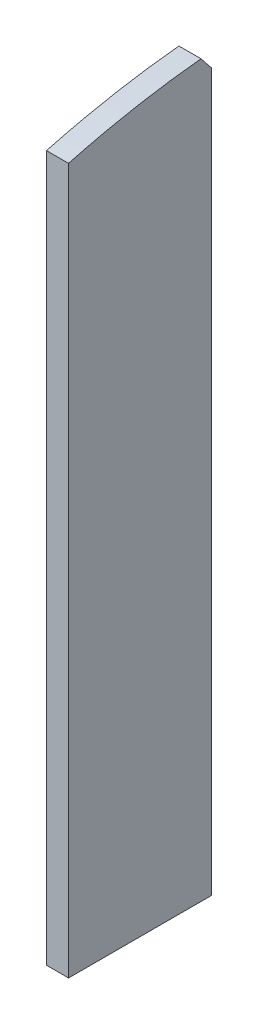
ISO-10303-21;
HEADER;
FILE_DESCRIPTION(('STEP AP214'),'2;1');
FILE_NAME('part.step','',(''),(''),'','','');
FILE_SCHEMA(('AUTOMOTIVE_DESIGN { 1 0 10303 214 1 1 1 1 }'));
ENDSEC;
DATA;
#1=APPLICATION_CONTEXT('core data for automotive mechanical design processes');
#2=APPLICATION_PROTOCOL_DEFINITION('international standard','automotive_design',2000,#1);
#3=PRODUCT_CONTEXT('',#1,'mechanical');
#4=PRODUCT('Part','Part','',(#3));
#5=PRODUCT_RELATED_PRODUCT_CATEGORY('part','',(#4));
#6=PRODUCT_DEFINITION_FORMATION('','',#4);
#7=PRODUCT_DEFINITION_CONTEXT('part definition',#1,'design');
#8=PRODUCT_DEFINITION('design','',#6,#7);
#9=PRODUCT_DEFINITION_SHAPE('','',#8);
#10=(LENGTH_UNIT() NAMED_UNIT(*) SI_UNIT(.MILLI.,.METRE.));
#11=(NAMED_UNIT(*) PLANE_ANGLE_UNIT() SI_UNIT($,.RADIAN.));
#12=(NAMED_UNIT(*) SI_UNIT($,.STERADIAN.) SOLID_ANGLE_UNIT());
#13=UNCERTAINTY_MEASURE_WITH_UNIT(LENGTH_MEASURE(1.E-05),#10,'distance_accuracy_value','');
#14=(GEOMETRIC_REPRESENTATION_CONTEXT(3) GLOBAL_UNCERTAINTY_ASSIGNED_CONTEXT((#13)) GLOBAL_UNIT_ASSIGNED_CONTEXT((#10,
#11,#12)) REPRESENTATION_CONTEXT('',''));
#15=CARTESIAN_POINT('',(0.,0.,0.));
#16=DIRECTION('',(0.,0.,1.));
#17=DIRECTION('',(1.,0.,0.));
#18=AXIS2_PLACEMENT_3D('',#15,#16,#17);
#19=CARTESIAN_POINT('',(104.28868330265,114.693871368356,-0.721874428030816));
#20=CARTESIAN_POINT('',(105.48868330265,114.693871368356,-0.721874428030816));
#21=CARTESIAN_POINT('',(104.28868330265,114.593132991804,0.425284995218334));
#22=CARTESIAN_POINT('',(105.48868330265,114.593132991804,0.425284995218334));
#23=CARTESIAN_POINT('',(104.28868330265,114.43837487725,1.56942444799219));
#24=CARTESIAN_POINT('',(105.48868330265,114.43837487725,1.56942444799219));
#25=CARTESIAN_POINT('',(104.28868330265,114.231931561013,2.70316256949073));
#26=CARTESIAN_POINT('',(105.48868330265,114.231931561013,2.70316256949073));
#27=CARTESIAN_POINT('',(104.28868330265,114.073911996315,3.57096884050802));
#28=CARTESIAN_POINT('',(105.48868330265,114.073911996315,3.57096884050802));
#29=CARTESIAN_POINT('',(104.28868330265,113.885486885392,4.43338224717982));
#30=CARTESIAN_POINT('',(105.48868330265,113.885486885392,4.43338224717982));
#31=CARTESIAN_POINT('',(104.28868330265,113.6673755514,5.28806416190314));
#32=CARTESIAN_POINT('',(105.48868330265,113.6673755514,5.28806416190314));
#33=CARTESIAN_POINT('',(104.28868330265,113.429806278742,6.2189931380248));
#34=CARTESIAN_POINT('',(105.48868330265,113.429806278742,6.2189931380248));
#35=CARTESIAN_POINT('',(104.28868330265,113.155789957766,7.1455588916234));
#36=CARTESIAN_POINT('',(105.48868330265,113.155789957766,7.1455588916234));
#37=CARTESIAN_POINT('',(104.28868330265,112.852853509122,8.05726099115746));
#38=CARTESIAN_POINT('',(105.48868330265,112.852853509122,8.05726099115746));
#39=CARTESIAN_POINT('',(104.28868330265,112.546302948539,8.97983993782439));
#40=CARTESIAN_POINT('',(105.48868330265,112.546302948539,8.97983993782439));
#41=CARTESIAN_POINT('',(104.28868330265,112.207250987622,9.89594795173836));
#42=CARTESIAN_POINT('',(105.48868330265,112.207250987622,9.89594795173836));
#43=CARTESIAN_POINT('',(104.28868330265,111.842740230479,10.7971588153841));
#44=CARTESIAN_POINT('',(105.48868330265,111.842740230479,10.7971588153841));
#45=CARTESIAN_POINT('',(104.28868330265,111.817805897079,10.858806082843));
#46=CARTESIAN_POINT('',(105.48868330265,111.817805897079,10.858806082843));
#47=CARTESIAN_POINT('',(104.28868330265,111.792744817781,10.9204025739335));
#48=CARTESIAN_POINT('',(105.48868330265,111.792744817781,10.9204025739335));
#49=CARTESIAN_POINT('',(104.28868330265,111.767558404928,10.9819470566923));
#50=CARTESIAN_POINT('',(105.48868330265,111.767558404928,10.9819470566923));
#51=CARTESIAN_POINT('',(104.28868330265,111.348399468635,12.0061865972319));
#52=CARTESIAN_POINT('',(105.48868330265,111.348399468635,12.0061865972319));
#53=CARTESIAN_POINT('',(104.28868330265,110.893423700899,13.0187188961143));
#54=CARTESIAN_POINT('',(105.48868330265,110.893423700899,13.0187188961143));
#55=CARTESIAN_POINT('',(104.28868330265,110.402822797709,14.0107678907567));
#56=CARTESIAN_POINT('',(105.48868330265,110.402822797709,14.0107678907567));
#57=CARTESIAN_POINT('',(104.28868330265,110.377200232236,14.0625795367453));
#58=CARTESIAN_POINT('',(105.48868330265,110.377200232236,14.0625795367453));
#59=CARTESIAN_POINT('',(104.28868330265,110.351475008834,14.1143464039091));
#60=CARTESIAN_POINT('',(105.48868330265,110.351475008834,14.1143464039091));
#61=CARTESIAN_POINT('',(104.28868330265,110.325647005445,14.1660672814714));
#62=CARTESIAN_POINT('',(105.48868330265,110.325647005445,14.1660672814714));
#63=(BOUNDED_SURFACE() B_SPLINE_SURFACE(3,1,((#19,#20),(#21,#22),(#23,#24),(#25,#26),(#27,#28),
(#29,#30),(#31,#32),(#33,#34),(#35,#36),(#37,#38),(#39,#40),(#41,#42),(#43,#44),(#45,#46),(#47,
#48),(#49,#50),(#51,#52),(#53,#54),(#55,#56),(#57,#58),(#59,#60),(#61,#62)),.UNSPECIFIED.,.F.,
.F.,.F.) B_SPLINE_SURFACE_WITH_KNOTS((4,3,3,3,3,3,3,4),(2,2),(-1.05572550338823,2.4026804886413,
5.04958749407472,7.93730010123336,10.8584487397272,11.0579458880345,14.3814207751686,
14.5549785190155),(0.,0.120000000000002),
.UNSPECIFIED.) GEOMETRIC_REPRESENTATION_ITEM() RATIONAL_B_SPLINE_SURFACE(((1.,1.),(1.,1.),(1.,
1.),(1.,1.),(1.,1.),(1.,1.),(1.,1.),(1.,1.),(1.,1.),(1.,1.),(1.,1.),(1.,1.),(1.,1.),(1.,1.),(1.,
1.),(1.,1.),(1.,1.),(1.,1.),(1.,1.),(1.,1.),(1.,1.),(1.,1.))) REPRESENTATION_ITEM('') SURFACE());
#64=DIRECTION('',(1.,0.,0.));
#65=VECTOR('',#64,1.);
#66=CARTESIAN_POINT('',(104.78868330265,113.544065064813,5.75878809828096));
#67=LINE('',#66,#65);
#68=CARTESIAN_POINT('',(104.28868330265,113.544065064813,5.75878809828096));
#69=VERTEX_POINT('',#68);
#70=CARTESIAN_POINT('',(105.28868330265,113.544065064813,5.75878809828097));
#71=VERTEX_POINT('',#70);
#72=EDGE_CURVE('E58',#69,#71,#67,.T.);
#73=CARTESIAN_POINT('',(105.28868330265,114.693871368356,-0.721874428030816));
#74=CARTESIAN_POINT('',(105.28868330265,114.593132991804,0.425284995218334));
#75=CARTESIAN_POINT('',(105.28868330265,114.43837487725,1.56942444799219));
#76=CARTESIAN_POINT('',(105.28868330265,114.231931561013,2.70316256949073));
#77=CARTESIAN_POINT('',(105.28868330265,114.073911996315,3.57096884050802));
#78=CARTESIAN_POINT('',(105.28868330265,113.885486885392,4.43338224717976));
#79=CARTESIAN_POINT('',(105.28868330265,113.6673755514,5.28806416190314));
#80=CARTESIAN_POINT('',(105.28868330265,113.578644182837,5.63576317685737));
#81=CARTESIAN_POINT('',(105.28868330265,113.484828455526,5.98285352280742));
#82=CARTESIAN_POINT('',(105.28868330265,113.386320542812,6.32878809828087));
#83=(BOUNDED_CURVE() B_SPLINE_CURVE(3,(#73,#74,#75,#76,#77,#78,#79,#80,#81,#82),.UNSPECIFIED.,
.F.,.F.) B_SPLINE_CURVE_WITH_KNOTS((4,3,3,4),(-1.05572550338823,2.4026804886413,
5.04958749407472,6.12813897838123),
.UNSPECIFIED.) CURVE() GEOMETRIC_REPRESENTATION_ITEM() RATIONAL_B_SPLINE_CURVE((1.,1.,1.,1.,1.,
1.,1.,1.,1.,1.)) REPRESENTATION_ITEM(''));
#84=CARTESIAN_POINT('',(105.28868330265,114.648760082344,-0.243916728537173));
#85=VERTEX_POINT('',#84);
#86=EDGE_CURVE('E105',#85,#71,#83,.T.);
#87=DIRECTION('',(1.,0.,0.));
#88=VECTOR('',#87,1.);
#89=CARTESIAN_POINT('',(104.78868330265,114.648760082344,-0.243916728537173));
#90=LINE('',#89,#88);
#91=CARTESIAN_POINT('',(104.28868330265,114.648760082344,-0.2439167285373));
#92=VERTEX_POINT('',#91);
#93=EDGE_CURVE('E123',#92,#85,#90,.T.);
#94=CARTESIAN_POINT('',(104.28868330265,114.680886038256,-0.577277018546141));
#95=CARTESIAN_POINT('',(104.28868330265,114.580035583259,0.521422128537125));
#96=CARTESIAN_POINT('',(104.28868330265,114.429699946871,1.61706512462914));
#97=CARTESIAN_POINT('',(104.28868330265,114.231931561013,2.70316256949073));
#98=CARTESIAN_POINT('',(104.28868330265,114.073911996315,3.57096884050802));
#99=CARTESIAN_POINT('',(104.28868330265,113.885486885392,4.43338224717982));
#100=CARTESIAN_POINT('',(104.28868330265,113.6673755514,5.28806416190314));
#101=CARTESIAN_POINT('',(104.28868330265,113.578644182837,5.63576317685737));
#102=CARTESIAN_POINT('',(104.28868330265,113.484828455526,5.98285352280742));
#103=CARTESIAN_POINT('',(104.28868330265,113.386320542812,6.32878809828087));
#104=(BOUNDED_CURVE() B_SPLINE_CURVE(3,(#94,#95,#96,#97,#98,#99,#100,#101,#102,#103),
.UNSPECIFIED.,.F.,.F.) B_SPLINE_CURVE_WITH_KNOTS((4,3,3,4),(-0.910400230804323,2.4026804886413,
5.04958749407472,6.12813897838123),
.UNSPECIFIED.) CURVE() GEOMETRIC_REPRESENTATION_ITEM() RATIONAL_B_SPLINE_CURVE((1.,1.,1.,1.,1.,
1.,1.,1.,1.,1.)) REPRESENTATION_ITEM(''));
#105=EDGE_CURVE('E110',#92,#69,#104,.T.);
#106=ORIENTED_EDGE('',*,*,#72,.T.);
#107=ORIENTED_EDGE('',*,*,#86,.F.);
#108=ORIENTED_EDGE('',*,*,#93,.F.);
#109=ORIENTED_EDGE('',*,*,#105,.T.);
#110=EDGE_LOOP('',(#106,#107,#108,#109));
#111=FACE_BOUND('',#110,.T.);
#112=ADVANCED_FACE('F41',(#111),#63,.T.);
#113=CARTESIAN_POINT('',(104.28868330265,98.1279178414338,-0.721874428030787));
#114=DIRECTION('',(0.,0.,-1.));
#115=DIRECTION('',(0.,-1.,0.));
#116=AXIS2_PLACEMENT_3D('',#113,#114,#115);
#117=PLANE('',#116);
#118=DIRECTION('',(-1.,0.,0.));
#119=VECTOR('',#118,1.);
#120=CARTESIAN_POINT('',(104.28868330265,114.050427103949,-0.721874428030814));
#121=LINE('',#120,#119);
#122=CARTESIAN_POINT('',(105.28868330265,114.050427103949,-0.721874428030816));
#123=VERTEX_POINT('',#122);
#124=CARTESIAN_POINT('',(104.28868330265,114.050427103949,-0.721874428030816));
#125=VERTEX_POINT('',#124);
#126=EDGE_CURVE('E65',#123,#125,#121,.T.);
#127=ORIENTED_EDGE('',*,*,#126,.F.);
#128=DIRECTION('',(0.,1.,0.));
#129=VECTOR('',#128,1.);
#130=CARTESIAN_POINT('',(105.28868330265,81.5619643145119,-0.721874428030759));
#131=LINE('',#130,#129);
#132=CARTESIAN_POINT('',(105.28868330265,81.5619643145119,-0.721874428030759));
#133=VERTEX_POINT('',#132);
#134=EDGE_CURVE('E109',#133,#123,#131,.T.);
#135=ORIENTED_EDGE('',*,*,#134,.F.);
#136=DIRECTION('',(1.,0.,0.));
#137=VECTOR('',#136,1.);
#138=CARTESIAN_POINT('',(104.28868330265,81.5619643145119,-0.721874428030759));
#139=LINE('',#138,#137);
#140=CARTESIAN_POINT('',(104.28868330265,81.5619643145119,-0.721874428030759));
#141=VERTEX_POINT('',#140);
#142=EDGE_CURVE('E50',#141,#133,#139,.T.);
#143=ORIENTED_EDGE('',*,*,#142,.F.);
#144=DIRECTION('',(0.,1.,0.));
#145=VECTOR('',#144,1.);
#146=CARTESIAN_POINT('',(104.28868330265,81.5619643145119,-0.721874428030759));
#147=LINE('',#146,#145);
#148=EDGE_CURVE('E119',#141,#125,#147,.T.);
#149=ORIENTED_EDGE('',*,*,#148,.T.);
#150=EDGE_LOOP('',(#127,#135,#143,#149));
#151=FACE_BOUND('',#150,.T.);
#152=ADVANCED_FACE('F43',(#151),#117,.T.);
#153=CARTESIAN_POINT('',(104.28868330265,81.5619643145119,6.72209642672036));
#154=DIRECTION('',(0.,-1.,0.));
#155=DIRECTION('',(0.,0.,-1.));
#156=AXIS2_PLACEMENT_3D('',#153,#154,#155);
#157=PLANE('',#156);
#158=DIRECTION('',(-1.,0.,0.));
#159=VECTOR('',#158,1.);
#160=CARTESIAN_POINT('',(105.28968330265,81.5619643145119,5.75878809828097));
#161=LINE('',#160,#159);
#162=CARTESIAN_POINT('',(105.28868330265,81.5619643145119,5.75878809828097));
#163=VERTEX_POINT('',#162);
#164=CARTESIAN_POINT('',(104.28868330265,81.5619643145119,5.75878809828097));
#165=VERTEX_POINT('',#164);
#166=EDGE_CURVE('E87',#163,#165,#161,.T.);
#167=ORIENTED_EDGE('',*,*,#166,.T.);
#168=DIRECTION('',(0.,0.,-1.));
#169=VECTOR('',#168,1.);
#170=CARTESIAN_POINT('',(104.28868330265,81.5619643145119,6.32878809828097));
#171=LINE('',#170,#169);
#172=EDGE_CURVE('E114',#165,#141,#171,.T.);
#173=ORIENTED_EDGE('',*,*,#172,.T.);
#174=ORIENTED_EDGE('',*,*,#142,.T.);
#175=DIRECTION('',(0.,0.,-1.));
#176=VECTOR('',#175,1.);
#177=CARTESIAN_POINT('',(105.28868330265,81.5619643145119,6.32878809828097));
#178=LINE('',#177,#176);
#179=EDGE_CURVE('E101',#163,#133,#178,.T.);
#180=ORIENTED_EDGE('',*,*,#179,.F.);
#181=EDGE_LOOP('',(#167,#173,#174,#180));
#182=FACE_BOUND('',#181,.T.);
#183=ADVANCED_FACE('F106',(#182),#157,.T.);
#184=CARTESIAN_POINT('',(105.28868330265,113.211433728121,6.92553983959142));
#185=DIRECTION('',(1.,0.,0.));
#186=DIRECTION('',(0.,1.,0.));
#187=AXIS2_PLACEMENT_3D('',#184,#185,#186);
#188=PLANE('',#187);
#189=DIRECTION('',(0.,-1.,0.));
#190=VECTOR('',#189,1.);
#191=CARTESIAN_POINT('',(105.28868330265,114.44561108856,5.75878809828097));
#192=LINE('',#191,#190);
#193=EDGE_CURVE('E90',#71,#163,#192,.T.);
#194=ORIENTED_EDGE('',*,*,#193,.T.);
#195=ORIENTED_EDGE('',*,*,#179,.T.);
#196=ORIENTED_EDGE('',*,*,#134,.T.);
#197=DIRECTION('',(0.,-0.781320029209134,-0.62413060488702));
#198=VECTOR('',#197,1.);
#199=CARTESIAN_POINT('',(105.28868330265,117.267483387065,1.84796022214323));
#200=LINE('',#199,#198);
#201=EDGE_CURVE('E95',#85,#123,#200,.T.);
#202=ORIENTED_EDGE('',*,*,#201,.F.);
#203=ORIENTED_EDGE('',*,*,#86,.T.);
#204=EDGE_LOOP('',(#194,#195,#196,#202,#203));
#205=FACE_BOUND('',#204,.T.);
#206=ADVANCED_FACE('F99',(#205),#188,.T.);
#207=CARTESIAN_POINT('',(104.28868330265,97.7208956128326,-0.721874428030787));
#208=DIRECTION('',(-1.,0.,0.));
#209=DIRECTION('',(0.,1.,0.));
#210=AXIS2_PLACEMENT_3D('',#207,#208,#209);
#211=PLANE('',#210);
#212=DIRECTION('',(0.,-1.,0.));
#213=VECTOR('',#212,1.);
#214=CARTESIAN_POINT('',(104.28868330265,114.44561108856,5.75878809828097));
#215=LINE('',#214,#213);
#216=EDGE_CURVE('E91',#69,#165,#215,.T.);
#217=ORIENTED_EDGE('',*,*,#216,.F.);
#218=ORIENTED_EDGE('',*,*,#105,.F.);
#219=DIRECTION('',(0.,0.781320029209134,0.62413060488702));
#220=VECTOR('',#219,1.);
#221=CARTESIAN_POINT('',(104.28868330265,104.081885175597,-8.68490093572429));
#222=LINE('',#221,#220);
#223=EDGE_CURVE('E11',#125,#92,#222,.T.);
#224=ORIENTED_EDGE('',*,*,#223,.F.);
#225=ORIENTED_EDGE('',*,*,#148,.F.);
#226=ORIENTED_EDGE('',*,*,#172,.F.);
#227=EDGE_LOOP('',(#217,#218,#224,#225,#226));
#228=FACE_BOUND('',#227,.T.);
#229=ADVANCED_FACE('F145',(#228),#211,.T.);
#230=CARTESIAN_POINT('',(114.28868330265,113.842114394426,-0.888277863934444));
#231=DIRECTION('',(0.,-0.62413060488702,0.781320029209134));
#232=DIRECTION('',(0.,-0.781320029209134,-0.62413060488702));
#233=AXIS2_PLACEMENT_3D('',#230,#231,#232);
#234=PLANE('',#233);
#235=ORIENTED_EDGE('',*,*,#93,.T.);
#236=ORIENTED_EDGE('',*,*,#201,.T.);
#237=ORIENTED_EDGE('',*,*,#126,.T.);
#238=ORIENTED_EDGE('',*,*,#223,.T.);
#239=EDGE_LOOP('',(#235,#236,#237,#238));
#240=FACE_BOUND('',#239,.T.);
#241=ADVANCED_FACE('F150',(#240),#234,.F.);
#242=CARTESIAN_POINT('',(105.28968330265,114.44561108856,5.75878809828097));
#243=DIRECTION('',(0.,0.,-1.));
#244=DIRECTION('',(-1.,0.,0.));
#245=AXIS2_PLACEMENT_3D('',#242,#243,#244);
#246=PLANE('',#245);
#247=ORIENTED_EDGE('',*,*,#216,.T.);
#248=ORIENTED_EDGE('',*,*,#166,.F.);
#249=ORIENTED_EDGE('',*,*,#193,.F.);
#250=ORIENTED_EDGE('',*,*,#72,.F.);
#251=EDGE_LOOP('',(#247,#248,#249,#250));
#252=FACE_BOUND('',#251,.T.);
#253=ADVANCED_FACE('F89',(#252),#246,.F.);
#254=CLOSED_SHELL('',(#112,#152,#183,#206,#229,#241,#253));
#255=MANIFOLD_SOLID_BREP('B2',#254);
#256=ADVANCED_BREP_SHAPE_REPRESENTATION('',(#18,#255),#14);
#257=SHAPE_DEFINITION_REPRESENTATION(#9,#256);
ENDSEC;
END-ISO-10303-21;
